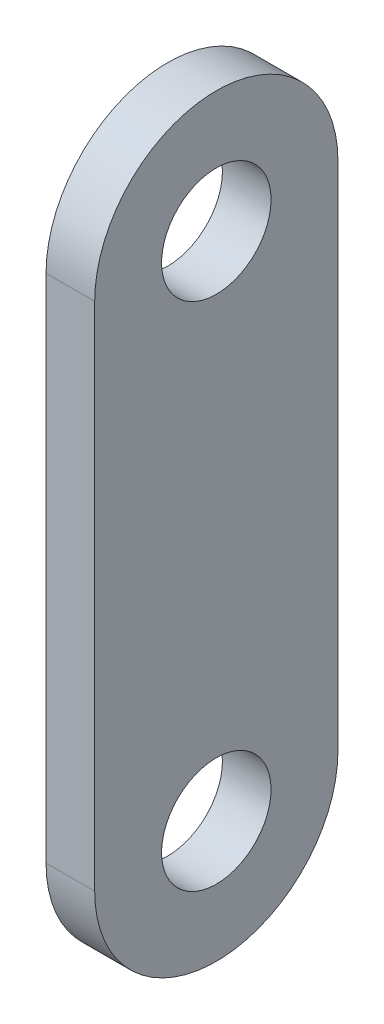
ISO-10303-21;
HEADER;
FILE_DESCRIPTION(('STEP AP214'),'2;1');
FILE_NAME('part.step','',(''),(''),'','','');
FILE_SCHEMA(('AUTOMOTIVE_DESIGN { 1 0 10303 214 1 1 1 1 }'));
ENDSEC;
DATA;
#1=APPLICATION_CONTEXT('core data for automotive mechanical design processes');
#2=APPLICATION_PROTOCOL_DEFINITION('international standard','automotive_design',2000,#1);
#3=PRODUCT_CONTEXT('',#1,'mechanical');
#4=PRODUCT('Part','Part','',(#3));
#5=PRODUCT_RELATED_PRODUCT_CATEGORY('part','',(#4));
#6=PRODUCT_DEFINITION_FORMATION('','',#4);
#7=PRODUCT_DEFINITION_CONTEXT('part definition',#1,'design');
#8=PRODUCT_DEFINITION('design','',#6,#7);
#9=PRODUCT_DEFINITION_SHAPE('','',#8);
#10=(LENGTH_UNIT() NAMED_UNIT(*) SI_UNIT(.MILLI.,.METRE.));
#11=(NAMED_UNIT(*) PLANE_ANGLE_UNIT() SI_UNIT($,.RADIAN.));
#12=(NAMED_UNIT(*) SI_UNIT($,.STERADIAN.) SOLID_ANGLE_UNIT());
#13=UNCERTAINTY_MEASURE_WITH_UNIT(LENGTH_MEASURE(1.E-05),#10,'distance_accuracy_value','');
#14=(GEOMETRIC_REPRESENTATION_CONTEXT(3) GLOBAL_UNCERTAINTY_ASSIGNED_CONTEXT((#13)) GLOBAL_UNIT_ASSIGNED_CONTEXT((#10,
#11,#12)) REPRESENTATION_CONTEXT('',''));
#15=CARTESIAN_POINT('',(0.,0.,0.));
#16=DIRECTION('',(0.,0.,1.));
#17=DIRECTION('',(1.,0.,0.));
#18=AXIS2_PLACEMENT_3D('',#15,#16,#17);
#19=CARTESIAN_POINT('',(6.35,0.,0.));
#20=DIRECTION('',(1.,0.,0.));
#21=DIRECTION('',(0.,0.,-1.));
#22=AXIS2_PLACEMENT_3D('',#19,#20,#21);
#23=PLANE('',#22);
#24=CARTESIAN_POINT('',(6.35,0.,0.));
#25=DIRECTION('',(1.,0.,0.));
#26=DIRECTION('',(0.,0.,-1.));
#27=AXIS2_PLACEMENT_3D('',#24,#25,#26);
#28=CIRCLE('',#27,7.14375);
#29=CARTESIAN_POINT('',(6.35,0.,-7.14375));
#30=VERTEX_POINT('',#29);
#31=EDGE_CURVE('E101',#30,#30,#28,.T.);
#32=ORIENTED_EDGE('',*,*,#31,.F.);
#33=EDGE_LOOP('',(#32));
#34=FACE_BOUND('',#33,.T.);
#35=CARTESIAN_POINT('',(6.35,0.,0.));
#36=DIRECTION('',(1.,0.,0.));
#37=DIRECTION('',(0.,0.,-1.));
#38=AXIS2_PLACEMENT_3D('',#35,#36,#37);
#39=CIRCLE('',#38,15.875);
#40=CARTESIAN_POINT('',(6.35,0.,-15.875));
#41=VERTEX_POINT('',#40);
#42=CARTESIAN_POINT('',(6.35,0.,15.875));
#43=VERTEX_POINT('',#42);
#44=EDGE_CURVE('E86',#41,#43,#39,.T.);
#45=ORIENTED_EDGE('',*,*,#44,.T.);
#46=DIRECTION('',(0.,-1.,0.));
#47=VECTOR('',#46,1.);
#48=CARTESIAN_POINT('',(6.35,0.,15.875));
#49=LINE('',#48,#47);
#50=CARTESIAN_POINT('',(6.35,-66.675,15.875));
#51=VERTEX_POINT('',#50);
#52=EDGE_CURVE('E81',#43,#51,#49,.T.);
#53=ORIENTED_EDGE('',*,*,#52,.T.);
#54=CARTESIAN_POINT('',(6.35,-66.675,0.));
#55=DIRECTION('',(1.,0.,0.));
#56=DIRECTION('',(0.,0.,-1.));
#57=AXIS2_PLACEMENT_3D('',#54,#55,#56);
#58=CIRCLE('',#57,15.875);
#59=CARTESIAN_POINT('',(6.35,-66.675,-15.875));
#60=VERTEX_POINT('',#59);
#61=EDGE_CURVE('E84',#51,#60,#58,.T.);
#62=ORIENTED_EDGE('',*,*,#61,.T.);
#63=DIRECTION('',(0.,1.,0.));
#64=VECTOR('',#63,1.);
#65=CARTESIAN_POINT('',(6.35,0.,-15.875));
#66=LINE('',#65,#64);
#67=EDGE_CURVE('E51',#60,#41,#66,.T.);
#68=ORIENTED_EDGE('',*,*,#67,.T.);
#69=EDGE_LOOP('',(#45,#53,#62,#68));
#70=FACE_BOUND('',#69,.T.);
#71=CARTESIAN_POINT('',(6.35,-66.675,0.));
#72=DIRECTION('',(1.,0.,0.));
#73=DIRECTION('',(0.,0.,-1.));
#74=AXIS2_PLACEMENT_3D('',#71,#72,#73);
#75=CIRCLE('',#74,7.14375);
#76=CARTESIAN_POINT('',(6.35,-66.675,-7.14375000000001));
#77=VERTEX_POINT('',#76);
#78=EDGE_CURVE('E116',#77,#77,#75,.T.);
#79=ORIENTED_EDGE('',*,*,#78,.F.);
#80=EDGE_LOOP('',(#79));
#81=FACE_BOUND('',#80,.T.);
#82=ADVANCED_FACE('F34',(#34,#70,#81),#23,.T.);
#83=CARTESIAN_POINT('',(0.,0.,0.));
#84=DIRECTION('',(1.,0.,0.));
#85=DIRECTION('',(0.,0.,-1.));
#86=AXIS2_PLACEMENT_3D('',#83,#84,#85);
#87=PLANE('',#86);
#88=CARTESIAN_POINT('',(0.,0.,0.));
#89=DIRECTION('',(1.,0.,0.));
#90=DIRECTION('',(0.,0.,-1.));
#91=AXIS2_PLACEMENT_3D('',#88,#89,#90);
#92=CIRCLE('',#91,15.875);
#93=CARTESIAN_POINT('',(0.,0.,-15.875));
#94=VERTEX_POINT('',#93);
#95=CARTESIAN_POINT('',(0.,0.,15.875));
#96=VERTEX_POINT('',#95);
#97=EDGE_CURVE('E98',#94,#96,#92,.T.);
#98=ORIENTED_EDGE('',*,*,#97,.F.);
#99=DIRECTION('',(0.,1.,0.));
#100=VECTOR('',#99,1.);
#101=CARTESIAN_POINT('',(0.,0.,-15.875));
#102=LINE('',#101,#100);
#103=CARTESIAN_POINT('',(0.,-66.675,-15.875));
#104=VERTEX_POINT('',#103);
#105=EDGE_CURVE('E74',#104,#94,#102,.T.);
#106=ORIENTED_EDGE('',*,*,#105,.F.);
#107=CARTESIAN_POINT('',(0.,-66.675,0.));
#108=DIRECTION('',(1.,0.,0.));
#109=DIRECTION('',(0.,0.,-1.));
#110=AXIS2_PLACEMENT_3D('',#107,#108,#109);
#111=CIRCLE('',#110,15.875);
#112=CARTESIAN_POINT('',(0.,-66.675,15.875));
#113=VERTEX_POINT('',#112);
#114=EDGE_CURVE('E68',#113,#104,#111,.T.);
#115=ORIENTED_EDGE('',*,*,#114,.F.);
#116=DIRECTION('',(0.,-1.,0.));
#117=VECTOR('',#116,1.);
#118=CARTESIAN_POINT('',(0.,0.,15.875));
#119=LINE('',#118,#117);
#120=EDGE_CURVE('E90',#96,#113,#119,.T.);
#121=ORIENTED_EDGE('',*,*,#120,.F.);
#122=EDGE_LOOP('',(#98,#106,#115,#121));
#123=FACE_BOUND('',#122,.T.);
#124=CARTESIAN_POINT('',(0.,0.,0.));
#125=DIRECTION('',(1.,0.,0.));
#126=DIRECTION('',(0.,0.,-1.));
#127=AXIS2_PLACEMENT_3D('',#124,#125,#126);
#128=CIRCLE('',#127,7.14375);
#129=CARTESIAN_POINT('',(0.,0.,-7.14375));
#130=VERTEX_POINT('',#129);
#131=EDGE_CURVE('E113',#130,#130,#128,.T.);
#132=ORIENTED_EDGE('',*,*,#131,.T.);
#133=EDGE_LOOP('',(#132));
#134=FACE_BOUND('',#133,.T.);
#135=CARTESIAN_POINT('',(0.,-66.675,0.));
#136=DIRECTION('',(1.,0.,0.));
#137=DIRECTION('',(0.,0.,-1.));
#138=AXIS2_PLACEMENT_3D('',#135,#136,#137);
#139=CIRCLE('',#138,7.14375);
#140=CARTESIAN_POINT('',(0.,-66.675,-7.14375000000001));
#141=VERTEX_POINT('',#140);
#142=EDGE_CURVE('E119',#141,#141,#139,.T.);
#143=ORIENTED_EDGE('',*,*,#142,.T.);
#144=EDGE_LOOP('',(#143));
#145=FACE_BOUND('',#144,.T.);
#146=ADVANCED_FACE('F109',(#123,#134,#145),#87,.F.);
#147=CARTESIAN_POINT('',(6.35,0.,0.));
#148=DIRECTION('',(-1.,0.,0.));
#149=DIRECTION('',(0.,0.,1.));
#150=AXIS2_PLACEMENT_3D('',#147,#148,#149);
#151=CYLINDRICAL_SURFACE('',#150,15.875);
#152=ORIENTED_EDGE('',*,*,#97,.T.);
#153=DIRECTION('',(-1.,0.,0.));
#154=VECTOR('',#153,1.);
#155=CARTESIAN_POINT('',(6.35,0.,15.875));
#156=LINE('',#155,#154);
#157=EDGE_CURVE('E11',#43,#96,#156,.T.);
#158=ORIENTED_EDGE('',*,*,#157,.F.);
#159=ORIENTED_EDGE('',*,*,#44,.F.);
#160=DIRECTION('',(-1.,0.,0.));
#161=VECTOR('',#160,1.);
#162=CARTESIAN_POINT('',(6.35,0.,-15.875));
#163=LINE('',#162,#161);
#164=EDGE_CURVE('E94',#41,#94,#163,.T.);
#165=ORIENTED_EDGE('',*,*,#164,.T.);
#166=EDGE_LOOP('',(#152,#158,#159,#165));
#167=FACE_BOUND('',#166,.T.);
#168=ADVANCED_FACE('F36',(#167),#151,.T.);
#169=CARTESIAN_POINT('',(6.35,0.,15.875));
#170=DIRECTION('',(0.,0.,-1.));
#171=DIRECTION('',(0.,1.,0.));
#172=AXIS2_PLACEMENT_3D('',#169,#170,#171);
#173=PLANE('',#172);
#174=ORIENTED_EDGE('',*,*,#120,.T.);
#175=DIRECTION('',(-1.,0.,0.));
#176=VECTOR('',#175,1.);
#177=CARTESIAN_POINT('',(6.35,-66.675,15.875));
#178=LINE('',#177,#176);
#179=EDGE_CURVE('E43',#51,#113,#178,.T.);
#180=ORIENTED_EDGE('',*,*,#179,.F.);
#181=ORIENTED_EDGE('',*,*,#52,.F.);
#182=ORIENTED_EDGE('',*,*,#157,.T.);
#183=EDGE_LOOP('',(#174,#180,#181,#182));
#184=FACE_BOUND('',#183,.T.);
#185=ADVANCED_FACE('F89',(#184),#173,.F.);
#186=CARTESIAN_POINT('',(6.35,-66.675,0.));
#187=DIRECTION('',(-1.,0.,0.));
#188=DIRECTION('',(0.,0.,1.));
#189=AXIS2_PLACEMENT_3D('',#186,#187,#188);
#190=CYLINDRICAL_SURFACE('',#189,15.875);
#191=ORIENTED_EDGE('',*,*,#114,.T.);
#192=DIRECTION('',(-1.,0.,0.));
#193=VECTOR('',#192,1.);
#194=CARTESIAN_POINT('',(6.35,-66.675,-15.875));
#195=LINE('',#194,#193);
#196=EDGE_CURVE('E91',#60,#104,#195,.T.);
#197=ORIENTED_EDGE('',*,*,#196,.F.);
#198=ORIENTED_EDGE('',*,*,#61,.F.);
#199=ORIENTED_EDGE('',*,*,#179,.T.);
#200=EDGE_LOOP('',(#191,#197,#198,#199));
#201=FACE_BOUND('',#200,.T.);
#202=ADVANCED_FACE('F92',(#201),#190,.T.);
#203=CARTESIAN_POINT('',(6.35,0.,-15.875));
#204=DIRECTION('',(0.,0.,1.));
#205=DIRECTION('',(0.,-1.,0.));
#206=AXIS2_PLACEMENT_3D('',#203,#204,#205);
#207=PLANE('',#206);
#208=ORIENTED_EDGE('',*,*,#105,.T.);
#209=ORIENTED_EDGE('',*,*,#164,.F.);
#210=ORIENTED_EDGE('',*,*,#67,.F.);
#211=ORIENTED_EDGE('',*,*,#196,.T.);
#212=EDGE_LOOP('',(#208,#209,#210,#211));
#213=FACE_BOUND('',#212,.T.);
#214=ADVANCED_FACE('F106',(#213),#207,.F.);
#215=CARTESIAN_POINT('',(6.35,0.,0.));
#216=DIRECTION('',(-1.,0.,0.));
#217=DIRECTION('',(0.,0.,1.));
#218=AXIS2_PLACEMENT_3D('',#215,#216,#217);
#219=CYLINDRICAL_SURFACE('',#218,7.14375);
#220=ORIENTED_EDGE('',*,*,#31,.T.);
#221=EDGE_LOOP('',(#220));
#222=FACE_BOUND('',#221,.T.);
#223=ORIENTED_EDGE('',*,*,#131,.F.);
#224=EDGE_LOOP('',(#223));
#225=FACE_BOUND('',#224,.T.);
#226=ADVANCED_FACE('F136',(#222,#225),#219,.F.);
#227=CARTESIAN_POINT('',(6.35,-66.675,0.));
#228=DIRECTION('',(-1.,0.,0.));
#229=DIRECTION('',(0.,0.,1.));
#230=AXIS2_PLACEMENT_3D('',#227,#228,#229);
#231=CYLINDRICAL_SURFACE('',#230,7.14375);
#232=ORIENTED_EDGE('',*,*,#78,.T.);
#233=EDGE_LOOP('',(#232));
#234=FACE_BOUND('',#233,.T.);
#235=ORIENTED_EDGE('',*,*,#142,.F.);
#236=EDGE_LOOP('',(#235));
#237=FACE_BOUND('',#236,.T.);
#238=ADVANCED_FACE('F125',(#234,#237),#231,.F.);
#239=CLOSED_SHELL('',(#82,#146,#168,#185,#202,#214,#226,#238));
#240=MANIFOLD_SOLID_BREP('B2',#239);
#241=ADVANCED_BREP_SHAPE_REPRESENTATION('',(#18,#240),#14);
#242=SHAPE_DEFINITION_REPRESENTATION(#9,#241);
ENDSEC;
END-ISO-10303-21;
